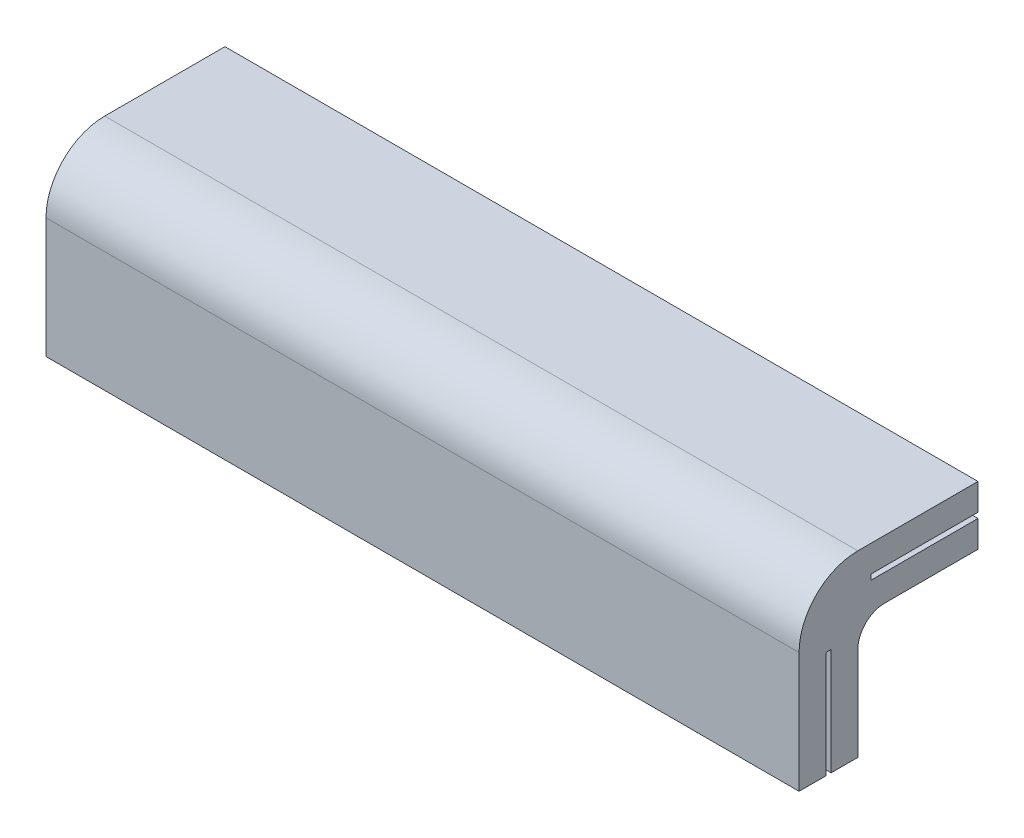
ISO-10303-21;
HEADER;
FILE_DESCRIPTION(('STEP AP214'),'2;1');
FILE_NAME('part.step','',(''),(''),'','','');
FILE_SCHEMA(('AUTOMOTIVE_DESIGN { 1 0 10303 214 1 1 1 1 }'));
ENDSEC;
DATA;
#1=APPLICATION_CONTEXT('core data for automotive mechanical design processes');
#2=APPLICATION_PROTOCOL_DEFINITION('international standard','automotive_design',2000,#1);
#3=PRODUCT_CONTEXT('',#1,'mechanical');
#4=PRODUCT('Part','Part','',(#3));
#5=PRODUCT_RELATED_PRODUCT_CATEGORY('part','',(#4));
#6=PRODUCT_DEFINITION_FORMATION('','',#4);
#7=PRODUCT_DEFINITION_CONTEXT('part definition',#1,'design');
#8=PRODUCT_DEFINITION('design','',#6,#7);
#9=PRODUCT_DEFINITION_SHAPE('','',#8);
#10=(LENGTH_UNIT() NAMED_UNIT(*) SI_UNIT(.MILLI.,.METRE.));
#11=(NAMED_UNIT(*) PLANE_ANGLE_UNIT() SI_UNIT($,.RADIAN.));
#12=(NAMED_UNIT(*) SI_UNIT($,.STERADIAN.) SOLID_ANGLE_UNIT());
#13=UNCERTAINTY_MEASURE_WITH_UNIT(LENGTH_MEASURE(1.E-05),#10,'distance_accuracy_value','');
#14=(GEOMETRIC_REPRESENTATION_CONTEXT(3) GLOBAL_UNCERTAINTY_ASSIGNED_CONTEXT((#13)) GLOBAL_UNIT_ASSIGNED_CONTEXT((#10,
#11,#12)) REPRESENTATION_CONTEXT('',''));
#15=CARTESIAN_POINT('',(0.,0.,0.));
#16=DIRECTION('',(0.,0.,1.));
#17=DIRECTION('',(1.,0.,0.));
#18=AXIS2_PLACEMENT_3D('',#15,#16,#17);
#19=CARTESIAN_POINT('',(285.752308678997,185.,-12.));
#20=DIRECTION('',(0.,1.,0.));
#21=DIRECTION('',(0.,0.,1.));
#22=AXIS2_PLACEMENT_3D('',#19,#20,#21);
#23=PLANE('',#22);
#24=DIRECTION('',(1.,0.,0.));
#25=VECTOR('',#24,1.);
#26=CARTESIAN_POINT('',(285.752308678997,185.,-2.));
#27=LINE('',#26,#25);
#28=CARTESIAN_POINT('',(-141.,185.,-2.));
#29=VERTEX_POINT('',#28);
#30=CARTESIAN_POINT('',(141.,185.,-2.));
#31=VERTEX_POINT('',#30);
#32=EDGE_CURVE('E146',#29,#31,#27,.T.);
#33=ORIENTED_EDGE('',*,*,#32,.F.);
#34=DIRECTION('',(0.,0.,-1.));
#35=VECTOR('',#34,1.);
#36=CARTESIAN_POINT('',(-141.,185.,-12.));
#37=LINE('',#36,#35);
#38=CARTESIAN_POINT('',(-141.,185.,-12.));
#39=VERTEX_POINT('',#38);
#40=EDGE_CURVE('E170',#29,#39,#37,.T.);
#41=ORIENTED_EDGE('',*,*,#40,.T.);
#42=DIRECTION('',(-1.,0.,0.));
#43=VECTOR('',#42,1.);
#44=CARTESIAN_POINT('',(285.752308678997,185.,-12.));
#45=LINE('',#44,#43);
#46=CARTESIAN_POINT('',(141.,185.,-12.));
#47=VERTEX_POINT('',#46);
#48=EDGE_CURVE('E246',#47,#39,#45,.T.);
#49=ORIENTED_EDGE('',*,*,#48,.F.);
#50=DIRECTION('',(0.,0.,-1.));
#51=VECTOR('',#50,1.);
#52=CARTESIAN_POINT('',(141.,185.,-12.));
#53=LINE('',#52,#51);
#54=EDGE_CURVE('E236',#31,#47,#53,.T.);
#55=ORIENTED_EDGE('',*,*,#54,.F.);
#56=EDGE_LOOP('',(#33,#41,#49,#55));
#57=FACE_BOUND('',#56,.T.);
#58=ADVANCED_FACE('F32',(#57),#23,.F.);
#59=CARTESIAN_POINT('',(285.752308678997,230.,10.));
#60=DIRECTION('',(0.,0.,-1.));
#61=DIRECTION('',(0.,1.,0.));
#62=AXIS2_PLACEMENT_3D('',#59,#60,#61);
#63=PLANE('',#62);
#64=DIRECTION('',(0.,-1.,0.));
#65=VECTOR('',#64,1.);
#66=CARTESIAN_POINT('',(141.,230.,10.));
#67=LINE('',#66,#65);
#68=CARTESIAN_POINT('',(141.,230.,10.));
#69=VERTEX_POINT('',#68);
#70=CARTESIAN_POINT('',(141.,185.,9.99999999999999));
#71=VERTEX_POINT('',#70);
#72=EDGE_CURVE('E237',#69,#71,#67,.T.);
#73=ORIENTED_EDGE('',*,*,#72,.F.);
#74=DIRECTION('',(-1.,0.,0.));
#75=VECTOR('',#74,1.);
#76=CARTESIAN_POINT('',(285.752308678997,230.,10.));
#77=LINE('',#76,#75);
#78=CARTESIAN_POINT('',(-141.,230.,10.));
#79=VERTEX_POINT('',#78);
#80=EDGE_CURVE('E55',#69,#79,#77,.T.);
#81=ORIENTED_EDGE('',*,*,#80,.T.);
#82=DIRECTION('',(0.,-1.,0.));
#83=VECTOR('',#82,1.);
#84=CARTESIAN_POINT('',(-141.,230.,10.));
#85=LINE('',#84,#83);
#86=CARTESIAN_POINT('',(-141.,185.,9.99999999999999));
#87=VERTEX_POINT('',#86);
#88=EDGE_CURVE('E175',#79,#87,#85,.T.);
#89=ORIENTED_EDGE('',*,*,#88,.T.);
#90=DIRECTION('',(-1.,0.,0.));
#91=VECTOR('',#90,1.);
#92=CARTESIAN_POINT('',(285.752308678997,185.,9.99999999999999));
#93=LINE('',#92,#91);
#94=EDGE_CURVE('E244',#71,#87,#93,.T.);
#95=ORIENTED_EDGE('',*,*,#94,.F.);
#96=EDGE_LOOP('',(#73,#81,#89,#95));
#97=FACE_BOUND('',#96,.T.);
#98=ADVANCED_FACE('F283',(#97),#63,.F.);
#99=CARTESIAN_POINT('',(-141.,185.,0.));
#100=VERTEX_POINT('',#99);
#101=EDGE_CURVE('E171',#87,#100,#37,.T.);
#102=ORIENTED_EDGE('',*,*,#101,.T.);
#103=DIRECTION('',(1.,0.,0.));
#104=VECTOR('',#103,1.);
#105=CARTESIAN_POINT('',(285.752308678997,185.,0.));
#106=LINE('',#105,#104);
#107=CARTESIAN_POINT('',(141.,185.,0.));
#108=VERTEX_POINT('',#107);
#109=EDGE_CURVE('E163',#100,#108,#106,.T.);
#110=ORIENTED_EDGE('',*,*,#109,.T.);
#111=EDGE_CURVE('E234',#71,#108,#53,.T.);
#112=ORIENTED_EDGE('',*,*,#111,.F.);
#113=ORIENTED_EDGE('',*,*,#94,.T.);
#114=EDGE_LOOP('',(#102,#110,#112,#113));
#115=FACE_BOUND('',#114,.T.);
#116=ADVANCED_FACE('F280',(#115),#23,.F.);
#117=CARTESIAN_POINT('',(285.752308678997,220.,-12.));
#118=DIRECTION('',(0.,0.,1.));
#119=DIRECTION('',(0.,-1.,0.));
#120=AXIS2_PLACEMENT_3D('',#117,#118,#119);
#121=PLANE('',#120);
#122=DIRECTION('',(0.,1.,0.));
#123=VECTOR('',#122,1.);
#124=CARTESIAN_POINT('',(141.,220.,-12.));
#125=LINE('',#124,#123);
#126=CARTESIAN_POINT('',(141.,220.,-12.));
#127=VERTEX_POINT('',#126);
#128=EDGE_CURVE('E231',#47,#127,#125,.T.);
#129=ORIENTED_EDGE('',*,*,#128,.F.);
#130=ORIENTED_EDGE('',*,*,#48,.T.);
#131=DIRECTION('',(0.,1.,0.));
#132=VECTOR('',#131,1.);
#133=CARTESIAN_POINT('',(-141.,220.,-12.));
#134=LINE('',#133,#132);
#135=CARTESIAN_POINT('',(-141.,220.,-12.));
#136=VERTEX_POINT('',#135);
#137=EDGE_CURVE('E174',#39,#136,#134,.T.);
#138=ORIENTED_EDGE('',*,*,#137,.T.);
#139=DIRECTION('',(-1.,0.,0.));
#140=VECTOR('',#139,1.);
#141=CARTESIAN_POINT('',(285.752308678997,220.,-12.));
#142=LINE('',#141,#140);
#143=EDGE_CURVE('E249',#127,#136,#142,.T.);
#144=ORIENTED_EDGE('',*,*,#143,.F.);
#145=EDGE_LOOP('',(#129,#130,#138,#144));
#146=FACE_BOUND('',#145,.T.);
#147=ADVANCED_FACE('F320',(#146),#121,.F.);
#148=CARTESIAN_POINT('',(285.752308678997,220.,-22.));
#149=DIRECTION('',(-1.,0.,0.));
#150=DIRECTION('',(0.,0.,1.));
#151=AXIS2_PLACEMENT_3D('',#148,#149,#150);
#152=CYLINDRICAL_SURFACE('',#151,10.);
#153=CARTESIAN_POINT('',(141.,220.,-22.));
#154=DIRECTION('',(1.,0.,0.));
#155=DIRECTION('',(0.,1.,0.));
#156=AXIS2_PLACEMENT_3D('',#153,#154,#155);
#157=CIRCLE('',#156,10.);
#158=CARTESIAN_POINT('',(141.,230.,-22.0000000000001));
#159=VERTEX_POINT('',#158);
#160=EDGE_CURVE('E228',#127,#159,#157,.F.);
#161=ORIENTED_EDGE('',*,*,#160,.F.);
#162=ORIENTED_EDGE('',*,*,#143,.T.);
#163=CARTESIAN_POINT('',(-141.,220.,-22.));
#164=DIRECTION('',(-1.,0.,0.));
#165=DIRECTION('',(0.,-1.,0.));
#166=AXIS2_PLACEMENT_3D('',#163,#164,#165);
#167=CIRCLE('',#166,10.);
#168=CARTESIAN_POINT('',(-141.,230.,-22.0000000000001));
#169=VERTEX_POINT('',#168);
#170=EDGE_CURVE('E201',#136,#169,#167,.T.);
#171=ORIENTED_EDGE('',*,*,#170,.T.);
#172=DIRECTION('',(-1.,0.,0.));
#173=VECTOR('',#172,1.);
#174=CARTESIAN_POINT('',(285.752308678997,230.,-22.0000000000001));
#175=LINE('',#174,#173);
#176=EDGE_CURVE('E251',#159,#169,#175,.T.);
#177=ORIENTED_EDGE('',*,*,#176,.F.);
#178=EDGE_LOOP('',(#161,#162,#171,#177));
#179=FACE_BOUND('',#178,.T.);
#180=ADVANCED_FACE('F315',(#179),#152,.F.);
#181=CARTESIAN_POINT('',(285.752308678997,230.,-22.0000000000001));
#182=DIRECTION('',(0.,1.,0.));
#183=DIRECTION('',(0.,0.,1.));
#184=AXIS2_PLACEMENT_3D('',#181,#182,#183);
#185=PLANE('',#184);
#186=DIRECTION('',(0.,0.,-1.));
#187=VECTOR('',#186,1.);
#188=CARTESIAN_POINT('',(141.,230.,-22.0000000000001));
#189=LINE('',#188,#187);
#190=CARTESIAN_POINT('',(141.,230.,-57.));
#191=VERTEX_POINT('',#190);
#192=EDGE_CURVE('E225',#159,#191,#189,.T.);
#193=ORIENTED_EDGE('',*,*,#192,.F.);
#194=ORIENTED_EDGE('',*,*,#176,.T.);
#195=DIRECTION('',(0.,0.,-1.));
#196=VECTOR('',#195,1.);
#197=CARTESIAN_POINT('',(-141.,230.,-22.0000000000001));
#198=LINE('',#197,#196);
#199=CARTESIAN_POINT('',(-141.,230.,-57.));
#200=VERTEX_POINT('',#199);
#201=EDGE_CURVE('E198',#169,#200,#198,.T.);
#202=ORIENTED_EDGE('',*,*,#201,.T.);
#203=DIRECTION('',(-1.,0.,0.));
#204=VECTOR('',#203,1.);
#205=CARTESIAN_POINT('',(285.752308678997,230.,-57.));
#206=LINE('',#205,#204);
#207=EDGE_CURVE('E253',#191,#200,#206,.T.);
#208=ORIENTED_EDGE('',*,*,#207,.F.);
#209=EDGE_LOOP('',(#193,#194,#202,#208));
#210=FACE_BOUND('',#209,.T.);
#211=ADVANCED_FACE('F312',(#210),#185,.F.);
#212=CARTESIAN_POINT('',(285.752308678997,240.,-57.));
#213=DIRECTION('',(0.,0.,1.));
#214=DIRECTION('',(1.,0.,0.));
#215=AXIS2_PLACEMENT_3D('',#212,#213,#214);
#216=PLANE('',#215);
#217=DIRECTION('',(0.,1.,0.));
#218=VECTOR('',#217,1.);
#219=CARTESIAN_POINT('',(141.,240.,-57.));
#220=LINE('',#219,#218);
#221=CARTESIAN_POINT('',(141.,240.,-57.));
#222=VERTEX_POINT('',#221);
#223=EDGE_CURVE('E222',#191,#222,#220,.T.);
#224=ORIENTED_EDGE('',*,*,#223,.F.);
#225=ORIENTED_EDGE('',*,*,#207,.T.);
#226=DIRECTION('',(0.,1.,0.));
#227=VECTOR('',#226,1.);
#228=CARTESIAN_POINT('',(-141.,240.,-57.));
#229=LINE('',#228,#227);
#230=CARTESIAN_POINT('',(-141.,240.,-57.));
#231=VERTEX_POINT('',#230);
#232=EDGE_CURVE('E195',#200,#231,#229,.T.);
#233=ORIENTED_EDGE('',*,*,#232,.T.);
#234=DIRECTION('',(-1.,0.,0.));
#235=VECTOR('',#234,1.);
#236=CARTESIAN_POINT('',(285.752308678997,240.,-57.));
#237=LINE('',#236,#235);
#238=EDGE_CURVE('E255',#222,#231,#237,.T.);
#239=ORIENTED_EDGE('',*,*,#238,.F.);
#240=EDGE_LOOP('',(#224,#225,#233,#239));
#241=FACE_BOUND('',#240,.T.);
#242=ADVANCED_FACE('F308',(#241),#216,.F.);
#243=CARTESIAN_POINT('',(285.752308678997,240.,-57.));
#244=DIRECTION('',(0.,-1.,0.));
#245=DIRECTION('',(0.,0.,-1.));
#246=AXIS2_PLACEMENT_3D('',#243,#244,#245);
#247=PLANE('',#246);
#248=DIRECTION('',(0.,0.,1.));
#249=VECTOR('',#248,1.);
#250=CARTESIAN_POINT('',(141.,240.,-57.));
#251=LINE('',#250,#249);
#252=CARTESIAN_POINT('',(141.,240.,-17.));
#253=VERTEX_POINT('',#252);
#254=EDGE_CURVE('E219',#222,#253,#251,.T.);
#255=ORIENTED_EDGE('',*,*,#254,.F.);
#256=ORIENTED_EDGE('',*,*,#238,.T.);
#257=DIRECTION('',(0.,0.,1.));
#258=VECTOR('',#257,1.);
#259=CARTESIAN_POINT('',(-141.,240.,-57.));
#260=LINE('',#259,#258);
#261=CARTESIAN_POINT('',(-141.,240.,-17.));
#262=VERTEX_POINT('',#261);
#263=EDGE_CURVE('E192',#231,#262,#260,.T.);
#264=ORIENTED_EDGE('',*,*,#263,.T.);
#265=DIRECTION('',(-1.,0.,0.));
#266=VECTOR('',#265,1.);
#267=CARTESIAN_POINT('',(285.752308678997,240.,-17.));
#268=LINE('',#267,#266);
#269=EDGE_CURVE('E257',#253,#262,#268,.T.);
#270=ORIENTED_EDGE('',*,*,#269,.F.);
#271=EDGE_LOOP('',(#255,#256,#264,#270));
#272=FACE_BOUND('',#271,.T.);
#273=ADVANCED_FACE('F305',(#272),#247,.F.);
#274=CARTESIAN_POINT('',(285.752308678997,242.,-17.));
#275=DIRECTION('',(0.,0.,1.));
#276=DIRECTION('',(1.,0.,0.));
#277=AXIS2_PLACEMENT_3D('',#274,#275,#276);
#278=PLANE('',#277);
#279=DIRECTION('',(0.,1.,0.));
#280=VECTOR('',#279,1.);
#281=CARTESIAN_POINT('',(141.,242.,-17.));
#282=LINE('',#281,#280);
#283=CARTESIAN_POINT('',(141.,242.,-17.));
#284=VERTEX_POINT('',#283);
#285=EDGE_CURVE('E216',#253,#284,#282,.T.);
#286=ORIENTED_EDGE('',*,*,#285,.F.);
#287=ORIENTED_EDGE('',*,*,#269,.T.);
#288=DIRECTION('',(0.,1.,0.));
#289=VECTOR('',#288,1.);
#290=CARTESIAN_POINT('',(-141.,242.,-17.));
#291=LINE('',#290,#289);
#292=CARTESIAN_POINT('',(-141.,242.,-17.));
#293=VERTEX_POINT('',#292);
#294=EDGE_CURVE('E189',#262,#293,#291,.T.);
#295=ORIENTED_EDGE('',*,*,#294,.T.);
#296=DIRECTION('',(-1.,0.,0.));
#297=VECTOR('',#296,1.);
#298=CARTESIAN_POINT('',(285.752308678997,242.,-17.));
#299=LINE('',#298,#297);
#300=EDGE_CURVE('E259',#284,#293,#299,.T.);
#301=ORIENTED_EDGE('',*,*,#300,.F.);
#302=EDGE_LOOP('',(#286,#287,#295,#301));
#303=FACE_BOUND('',#302,.T.);
#304=ADVANCED_FACE('F299',(#303),#278,.F.);
#305=CARTESIAN_POINT('',(285.752308678997,242.,-57.));
#306=DIRECTION('',(0.,1.,0.));
#307=DIRECTION('',(0.,0.,1.));
#308=AXIS2_PLACEMENT_3D('',#305,#306,#307);
#309=PLANE('',#308);
#310=DIRECTION('',(0.,0.,-1.));
#311=VECTOR('',#310,1.);
#312=CARTESIAN_POINT('',(141.,242.,-57.));
#313=LINE('',#312,#311);
#314=CARTESIAN_POINT('',(141.,242.,-57.));
#315=VERTEX_POINT('',#314);
#316=EDGE_CURVE('E213',#284,#315,#313,.T.);
#317=ORIENTED_EDGE('',*,*,#316,.F.);
#318=ORIENTED_EDGE('',*,*,#300,.T.);
#319=DIRECTION('',(0.,0.,-1.));
#320=VECTOR('',#319,1.);
#321=CARTESIAN_POINT('',(-141.,242.,-57.));
#322=LINE('',#321,#320);
#323=CARTESIAN_POINT('',(-141.,242.,-57.));
#324=VERTEX_POINT('',#323);
#325=EDGE_CURVE('E186',#293,#324,#322,.T.);
#326=ORIENTED_EDGE('',*,*,#325,.T.);
#327=DIRECTION('',(-1.,0.,0.));
#328=VECTOR('',#327,1.);
#329=CARTESIAN_POINT('',(285.752308678997,242.,-57.));
#330=LINE('',#329,#328);
#331=EDGE_CURVE('E261',#315,#324,#330,.T.);
#332=ORIENTED_EDGE('',*,*,#331,.F.);
#333=EDGE_LOOP('',(#317,#318,#326,#332));
#334=FACE_BOUND('',#333,.T.);
#335=ADVANCED_FACE('F296',(#334),#309,.F.);
#336=CARTESIAN_POINT('',(285.752308678997,252.,-57.));
#337=DIRECTION('',(0.,0.,1.));
#338=DIRECTION('',(1.,0.,0.));
#339=AXIS2_PLACEMENT_3D('',#336,#337,#338);
#340=PLANE('',#339);
#341=DIRECTION('',(0.,1.,0.));
#342=VECTOR('',#341,1.);
#343=CARTESIAN_POINT('',(141.,252.,-57.));
#344=LINE('',#343,#342);
#345=CARTESIAN_POINT('',(141.,252.,-57.));
#346=VERTEX_POINT('',#345);
#347=EDGE_CURVE('E210',#315,#346,#344,.T.);
#348=ORIENTED_EDGE('',*,*,#347,.F.);
#349=ORIENTED_EDGE('',*,*,#331,.T.);
#350=DIRECTION('',(0.,1.,0.));
#351=VECTOR('',#350,1.);
#352=CARTESIAN_POINT('',(-141.,252.,-57.));
#353=LINE('',#352,#351);
#354=CARTESIAN_POINT('',(-141.,252.,-57.));
#355=VERTEX_POINT('',#354);
#356=EDGE_CURVE('E183',#324,#355,#353,.T.);
#357=ORIENTED_EDGE('',*,*,#356,.T.);
#358=DIRECTION('',(-1.,0.,0.));
#359=VECTOR('',#358,1.);
#360=CARTESIAN_POINT('',(285.752308678997,252.,-57.));
#361=LINE('',#360,#359);
#362=EDGE_CURVE('E263',#346,#355,#361,.T.);
#363=ORIENTED_EDGE('',*,*,#362,.F.);
#364=EDGE_LOOP('',(#348,#349,#357,#363));
#365=FACE_BOUND('',#364,.T.);
#366=ADVANCED_FACE('F292',(#365),#340,.F.);
#367=CARTESIAN_POINT('',(285.752308678997,252.,-12.));
#368=DIRECTION('',(0.,-1.,0.));
#369=DIRECTION('',(0.,0.,-1.));
#370=AXIS2_PLACEMENT_3D('',#367,#368,#369);
#371=PLANE('',#370);
#372=DIRECTION('',(0.,0.,1.));
#373=VECTOR('',#372,1.);
#374=CARTESIAN_POINT('',(141.,252.,-12.));
#375=LINE('',#374,#373);
#376=CARTESIAN_POINT('',(141.,252.,-12.));
#377=VERTEX_POINT('',#376);
#378=EDGE_CURVE('E206',#346,#377,#375,.T.);
#379=ORIENTED_EDGE('',*,*,#378,.F.);
#380=ORIENTED_EDGE('',*,*,#362,.T.);
#381=DIRECTION('',(0.,0.,1.));
#382=VECTOR('',#381,1.);
#383=CARTESIAN_POINT('',(-141.,252.,-12.));
#384=LINE('',#383,#382);
#385=CARTESIAN_POINT('',(-141.,252.,-12.));
#386=VERTEX_POINT('',#385);
#387=EDGE_CURVE('E180',#355,#386,#384,.T.);
#388=ORIENTED_EDGE('',*,*,#387,.T.);
#389=DIRECTION('',(-1.,0.,0.));
#390=VECTOR('',#389,1.);
#391=CARTESIAN_POINT('',(285.752308678997,252.,-12.));
#392=LINE('',#391,#390);
#393=EDGE_CURVE('E243',#377,#386,#392,.T.);
#394=ORIENTED_EDGE('',*,*,#393,.F.);
#395=EDGE_LOOP('',(#379,#380,#388,#394));
#396=FACE_BOUND('',#395,.T.);
#397=ADVANCED_FACE('F289',(#396),#371,.F.);
#398=CARTESIAN_POINT('',(285.752308678997,230.,-12.));
#399=DIRECTION('',(-1.,0.,0.));
#400=DIRECTION('',(0.,0.,1.));
#401=AXIS2_PLACEMENT_3D('',#398,#399,#400);
#402=CYLINDRICAL_SURFACE('',#401,22.);
#403=CARTESIAN_POINT('',(141.,230.,-12.));
#404=DIRECTION('',(1.,0.,0.));
#405=DIRECTION('',(0.,1.,0.));
#406=AXIS2_PLACEMENT_3D('',#403,#404,#405);
#407=CIRCLE('',#406,22.);
#408=EDGE_CURVE('E240',#377,#69,#407,.T.);
#409=ORIENTED_EDGE('',*,*,#408,.F.);
#410=ORIENTED_EDGE('',*,*,#393,.T.);
#411=CARTESIAN_POINT('',(-141.,230.,-12.));
#412=DIRECTION('',(-1.,0.,0.));
#413=DIRECTION('',(0.,-1.,0.));
#414=AXIS2_PLACEMENT_3D('',#411,#412,#413);
#415=CIRCLE('',#414,22.);
#416=EDGE_CURVE('E178',#386,#79,#415,.F.);
#417=ORIENTED_EDGE('',*,*,#416,.T.);
#418=ORIENTED_EDGE('',*,*,#80,.F.);
#419=EDGE_LOOP('',(#409,#410,#417,#418));
#420=FACE_BOUND('',#419,.T.);
#421=ADVANCED_FACE('F284',(#420),#402,.T.);
#422=CARTESIAN_POINT('',(141.,-180.,-2.));
#423=DIRECTION('',(1.,0.,0.));
#424=DIRECTION('',(0.,0.,-1.));
#425=AXIS2_PLACEMENT_3D('',#422,#423,#424);
#426=PLANE('',#425);
#427=DIRECTION('',(0.,-1.,0.));
#428=VECTOR('',#427,1.);
#429=CARTESIAN_POINT('',(141.,-180.,0.));
#430=LINE('',#429,#428);
#431=CARTESIAN_POINT('',(141.,225.,0.));
#432=VERTEX_POINT('',#431);
#433=EDGE_CURVE('E162',#432,#108,#430,.T.);
#434=ORIENTED_EDGE('',*,*,#433,.F.);
#435=DIRECTION('',(0.,0.,1.));
#436=VECTOR('',#435,1.);
#437=CARTESIAN_POINT('',(141.,225.,-2.));
#438=LINE('',#437,#436);
#439=CARTESIAN_POINT('',(141.,225.,-2.));
#440=VERTEX_POINT('',#439);
#441=EDGE_CURVE('E150',#440,#432,#438,.T.);
#442=ORIENTED_EDGE('',*,*,#441,.F.);
#443=DIRECTION('',(0.,-1.,0.));
#444=VECTOR('',#443,1.);
#445=CARTESIAN_POINT('',(141.,-180.,-2.));
#446=LINE('',#445,#444);
#447=EDGE_CURVE('E143',#440,#31,#446,.T.);
#448=ORIENTED_EDGE('',*,*,#447,.T.);
#449=ORIENTED_EDGE('',*,*,#54,.T.);
#450=ORIENTED_EDGE('',*,*,#128,.T.);
#451=ORIENTED_EDGE('',*,*,#160,.T.);
#452=ORIENTED_EDGE('',*,*,#192,.T.);
#453=ORIENTED_EDGE('',*,*,#223,.T.);
#454=ORIENTED_EDGE('',*,*,#254,.T.);
#455=ORIENTED_EDGE('',*,*,#285,.T.);
#456=ORIENTED_EDGE('',*,*,#316,.T.);
#457=ORIENTED_EDGE('',*,*,#347,.T.);
#458=ORIENTED_EDGE('',*,*,#378,.T.);
#459=ORIENTED_EDGE('',*,*,#408,.T.);
#460=ORIENTED_EDGE('',*,*,#72,.T.);
#461=ORIENTED_EDGE('',*,*,#111,.T.);
#462=EDGE_LOOP('',(#434,#442,#448,#449,#450,#451,#452,#453,#454,#455,#456,#457,#458,#459,#460,#461));
#463=FACE_BOUND('',#462,.T.);
#464=ADVANCED_FACE('F34',(#463),#426,.T.);
#465=CARTESIAN_POINT('',(-141.,225.,-2.));
#466=DIRECTION('',(-1.,0.,0.));
#467=DIRECTION('',(0.,0.,1.));
#468=AXIS2_PLACEMENT_3D('',#465,#466,#467);
#469=PLANE('',#468);
#470=DIRECTION('',(0.,1.,0.));
#471=VECTOR('',#470,1.);
#472=CARTESIAN_POINT('',(-141.,225.,0.));
#473=LINE('',#472,#471);
#474=CARTESIAN_POINT('',(-141.,225.,0.));
#475=VERTEX_POINT('',#474);
#476=EDGE_CURVE('E11',#100,#475,#473,.T.);
#477=ORIENTED_EDGE('',*,*,#476,.F.);
#478=ORIENTED_EDGE('',*,*,#101,.F.);
#479=ORIENTED_EDGE('',*,*,#88,.F.);
#480=ORIENTED_EDGE('',*,*,#416,.F.);
#481=ORIENTED_EDGE('',*,*,#387,.F.);
#482=ORIENTED_EDGE('',*,*,#356,.F.);
#483=ORIENTED_EDGE('',*,*,#325,.F.);
#484=ORIENTED_EDGE('',*,*,#294,.F.);
#485=ORIENTED_EDGE('',*,*,#263,.F.);
#486=ORIENTED_EDGE('',*,*,#232,.F.);
#487=ORIENTED_EDGE('',*,*,#201,.F.);
#488=ORIENTED_EDGE('',*,*,#170,.F.);
#489=ORIENTED_EDGE('',*,*,#137,.F.);
#490=ORIENTED_EDGE('',*,*,#40,.F.);
#491=DIRECTION('',(0.,1.,0.));
#492=VECTOR('',#491,1.);
#493=CARTESIAN_POINT('',(-141.,225.,-2.));
#494=LINE('',#493,#492);
#495=CARTESIAN_POINT('',(-141.,225.,-2.));
#496=VERTEX_POINT('',#495);
#497=EDGE_CURVE('E209',#29,#496,#494,.T.);
#498=ORIENTED_EDGE('',*,*,#497,.T.);
#499=DIRECTION('',(0.,0.,-1.));
#500=VECTOR('',#499,1.);
#501=CARTESIAN_POINT('',(-141.,225.,-2.));
#502=LINE('',#501,#500);
#503=EDGE_CURVE('E40',#475,#496,#502,.T.);
#504=ORIENTED_EDGE('',*,*,#503,.F.);
#505=EDGE_LOOP('',(#477,#478,#479,#480,#481,#482,#483,#484,#485,#486,#487,#488,#489,#490,#498,#504));
#506=FACE_BOUND('',#505,.T.);
#507=ADVANCED_FACE('F270',(#506),#469,.T.);
#508=CARTESIAN_POINT('',(0.,0.,0.));
#509=DIRECTION('',(0.,0.,1.));
#510=DIRECTION('',(1.,0.,0.));
#511=AXIS2_PLACEMENT_3D('',#508,#509,#510);
#512=PLANE('',#511);
#513=ORIENTED_EDGE('',*,*,#433,.T.);
#514=ORIENTED_EDGE('',*,*,#109,.F.);
#515=ORIENTED_EDGE('',*,*,#476,.T.);
#516=DIRECTION('',(-1.,0.,0.));
#517=VECTOR('',#516,1.);
#518=CARTESIAN_POINT('',(191.,225.,0.));
#519=LINE('',#518,#517);
#520=EDGE_CURVE('E158',#432,#475,#519,.T.);
#521=ORIENTED_EDGE('',*,*,#520,.F.);
#522=EDGE_LOOP('',(#513,#514,#515,#521));
#523=FACE_BOUND('',#522,.T.);
#524=ADVANCED_FACE('F276',(#523),#512,.F.);
#525=CARTESIAN_POINT('',(191.,225.,-2.));
#526=DIRECTION('',(0.,1.,0.));
#527=DIRECTION('',(0.,0.,-1.));
#528=AXIS2_PLACEMENT_3D('',#525,#526,#527);
#529=PLANE('',#528);
#530=ORIENTED_EDGE('',*,*,#441,.T.);
#531=ORIENTED_EDGE('',*,*,#520,.T.);
#532=ORIENTED_EDGE('',*,*,#503,.T.);
#533=DIRECTION('',(-1.,0.,0.));
#534=VECTOR('',#533,1.);
#535=CARTESIAN_POINT('',(191.,225.,-2.));
#536=LINE('',#535,#534);
#537=EDGE_CURVE('E47',#440,#496,#536,.T.);
#538=ORIENTED_EDGE('',*,*,#537,.F.);
#539=EDGE_LOOP('',(#530,#531,#532,#538));
#540=FACE_BOUND('',#539,.T.);
#541=ADVANCED_FACE('F153',(#540),#529,.F.);
#542=CARTESIAN_POINT('',(0.,0.,-2.));
#543=DIRECTION('',(0.,0.,1.));
#544=DIRECTION('',(1.,0.,0.));
#545=AXIS2_PLACEMENT_3D('',#542,#543,#544);
#546=PLANE('',#545);
#547=ORIENTED_EDGE('',*,*,#537,.T.);
#548=ORIENTED_EDGE('',*,*,#497,.F.);
#549=ORIENTED_EDGE('',*,*,#32,.T.);
#550=ORIENTED_EDGE('',*,*,#447,.F.);
#551=EDGE_LOOP('',(#547,#548,#549,#550));
#552=FACE_BOUND('',#551,.T.);
#553=ADVANCED_FACE('F144',(#552),#546,.T.);
#554=CLOSED_SHELL('',(#58,#98,#116,#147,#180,#211,#242,#273,#304,#335,#366,#397,#421,#464,#507,
#524,#541,#553));
#555=MANIFOLD_SOLID_BREP('B2',#554);
#556=ADVANCED_BREP_SHAPE_REPRESENTATION('',(#18,#555),#14);
#557=SHAPE_DEFINITION_REPRESENTATION(#9,#556);
ENDSEC;
END-ISO-10303-21;
